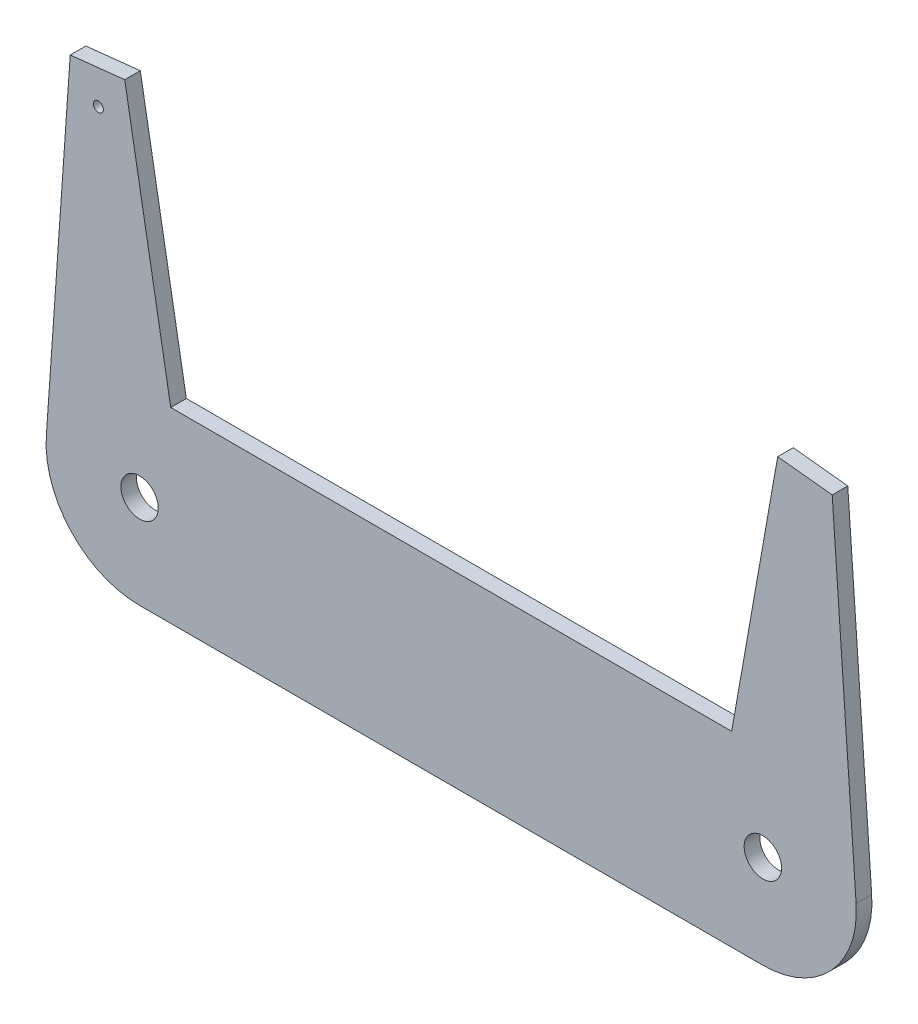
ISO-10303-21;
HEADER;
FILE_DESCRIPTION(('STEP AP214'),'2;1');
FILE_NAME('part.step','',(''),(''),'','','');
FILE_SCHEMA(('AUTOMOTIVE_DESIGN { 1 0 10303 214 1 1 1 1 }'));
ENDSEC;
DATA;
#1=APPLICATION_CONTEXT('core data for automotive mechanical design processes');
#2=APPLICATION_PROTOCOL_DEFINITION('international standard','automotive_design',2000,#1);
#3=PRODUCT_CONTEXT('',#1,'mechanical');
#4=PRODUCT('Part','Part','',(#3));
#5=PRODUCT_RELATED_PRODUCT_CATEGORY('part','',(#4));
#6=PRODUCT_DEFINITION_FORMATION('','',#4);
#7=PRODUCT_DEFINITION_CONTEXT('part definition',#1,'design');
#8=PRODUCT_DEFINITION('design','',#6,#7);
#9=PRODUCT_DEFINITION_SHAPE('','',#8);
#10=(LENGTH_UNIT() NAMED_UNIT(*) SI_UNIT(.MILLI.,.METRE.));
#11=(NAMED_UNIT(*) PLANE_ANGLE_UNIT() SI_UNIT($,.RADIAN.));
#12=(NAMED_UNIT(*) SI_UNIT($,.STERADIAN.) SOLID_ANGLE_UNIT());
#13=UNCERTAINTY_MEASURE_WITH_UNIT(LENGTH_MEASURE(1.E-05),#10,'distance_accuracy_value','');
#14=(GEOMETRIC_REPRESENTATION_CONTEXT(3) GLOBAL_UNCERTAINTY_ASSIGNED_CONTEXT((#13)) GLOBAL_UNIT_ASSIGNED_CONTEXT((#10,
#11,#12)) REPRESENTATION_CONTEXT('',''));
#15=CARTESIAN_POINT('',(0.,0.,0.));
#16=DIRECTION('',(0.,0.,1.));
#17=DIRECTION('',(1.,0.,0.));
#18=AXIS2_PLACEMENT_3D('',#15,#16,#17);
#19=CARTESIAN_POINT('',(-100.,0.,5.));
#20=DIRECTION('',(0.,0.,-1.));
#21=DIRECTION('',(-1.,0.,0.));
#22=AXIS2_PLACEMENT_3D('',#19,#20,#21);
#23=PLANE('',#22);
#24=DIRECTION('',(-0.069756473744122,-0.997564050259825,0.));
#25=VECTOR('',#24,1.);
#26=CARTESIAN_POINT('',(-122.253709395941,111.824739740904,5.));
#27=LINE('',#26,#25);
#28=CARTESIAN_POINT('',(-122.253709395941,111.824739740904,5.));
#29=VERTEX_POINT('',#28);
#30=CARTESIAN_POINT('',(-129.926921507795,2.0926942123237,5.));
#31=VERTEX_POINT('',#30);
#32=EDGE_CURVE('E161',#29,#31,#27,.T.);
#33=ORIENTED_EDGE('',*,*,#32,.T.);
#34=CARTESIAN_POINT('',(-100.,0.,5.));
#35=DIRECTION('',(0.,0.,1.));
#36=DIRECTION('',(-1.,0.,0.));
#37=AXIS2_PLACEMENT_3D('',#34,#35,#36);
#38=CIRCLE('',#37,30.);
#39=CARTESIAN_POINT('',(-100.,-30.,5.));
#40=VERTEX_POINT('',#39);
#41=EDGE_CURVE('E99',#31,#40,#38,.T.);
#42=ORIENTED_EDGE('',*,*,#41,.T.);
#43=DIRECTION('',(1.,0.,0.));
#44=VECTOR('',#43,1.);
#45=CARTESIAN_POINT('',(-100.,-30.,5.));
#46=LINE('',#45,#44);
#47=CARTESIAN_POINT('',(100.,-30.,5.));
#48=VERTEX_POINT('',#47);
#49=EDGE_CURVE('E182',#40,#48,#46,.T.);
#50=ORIENTED_EDGE('',*,*,#49,.T.);
#51=CARTESIAN_POINT('',(100.,0.,5.));
#52=DIRECTION('',(0.,0.,1.));
#53=DIRECTION('',(1.,0.,0.));
#54=AXIS2_PLACEMENT_3D('',#51,#52,#53);
#55=CIRCLE('',#54,30.);
#56=CARTESIAN_POINT('',(129.926921507795,2.0926942123236,5.));
#57=VERTEX_POINT('',#56);
#58=EDGE_CURVE('E201',#48,#57,#55,.T.);
#59=ORIENTED_EDGE('',*,*,#58,.T.);
#60=DIRECTION('',(-0.0697564737441215,0.997564050259824,0.));
#61=VECTOR('',#60,1.);
#62=CARTESIAN_POINT('',(122.253709395941,111.824739740904,5.));
#63=LINE('',#62,#61);
#64=CARTESIAN_POINT('',(122.253709395941,111.824739740904,5.));
#65=VERTEX_POINT('',#64);
#66=EDGE_CURVE('E198',#57,#65,#63,.T.);
#67=ORIENTED_EDGE('',*,*,#66,.T.);
#68=DIRECTION('',(-0.994251191251018,0.107072726200152,0.));
#69=VECTOR('',#68,1.);
#70=CARTESIAN_POINT('',(122.253709395941,111.824739740904,5.));
#71=LINE('',#70,#69);
#72=CARTESIAN_POINT('',(104.76009510169,113.708659006037,5.));
#73=VERTEX_POINT('',#72);
#74=EDGE_CURVE('E200',#65,#73,#71,.T.);
#75=ORIENTED_EDGE('',*,*,#74,.T.);
#76=DIRECTION('',(-0.173648177666936,-0.984807753012207,0.));
#77=VECTOR('',#76,1.);
#78=CARTESIAN_POINT('',(104.76009510169,113.708659006037,5.));
#79=LINE('',#78,#77);
#80=CARTESIAN_POINT('',(90.,30.0000000000001,5.));
#81=VERTEX_POINT('',#80);
#82=EDGE_CURVE('E124',#73,#81,#79,.T.);
#83=ORIENTED_EDGE('',*,*,#82,.T.);
#84=DIRECTION('',(-1.,0.,0.));
#85=VECTOR('',#84,1.);
#86=CARTESIAN_POINT('',(90.,30.0000000000001,5.));
#87=LINE('',#86,#85);
#88=CARTESIAN_POINT('',(-90.,30.0000000000001,5.));
#89=VERTEX_POINT('',#88);
#90=EDGE_CURVE('E118',#81,#89,#87,.T.);
#91=ORIENTED_EDGE('',*,*,#90,.T.);
#92=DIRECTION('',(-0.173648177666936,0.984807753012207,0.));
#93=VECTOR('',#92,1.);
#94=CARTESIAN_POINT('',(-104.76009510169,113.708659006038,5.));
#95=LINE('',#94,#93);
#96=CARTESIAN_POINT('',(-104.76009510169,113.708659006038,5.));
#97=VERTEX_POINT('',#96);
#98=EDGE_CURVE('E122',#89,#97,#95,.T.);
#99=ORIENTED_EDGE('',*,*,#98,.T.);
#100=DIRECTION('',(-0.994251191251018,-0.107072726200152,0.));
#101=VECTOR('',#100,1.);
#102=CARTESIAN_POINT('',(-122.253709395941,111.824739740904,5.));
#103=LINE('',#102,#101);
#104=EDGE_CURVE('E50',#97,#29,#103,.T.);
#105=ORIENTED_EDGE('',*,*,#104,.T.);
#106=EDGE_LOOP('',(#33,#42,#50,#59,#67,#75,#83,#91,#99,#105));
#107=FACE_BOUND('',#106,.T.);
#108=CARTESIAN_POINT('',(-113.211659226681,101.998451940931,5.));
#109=DIRECTION('',(0.,0.,1.));
#110=DIRECTION('',(1.,0.,0.));
#111=AXIS2_PLACEMENT_3D('',#108,#109,#110);
#112=CIRCLE('',#111,1.60000000000001);
#113=CARTESIAN_POINT('',(-111.611659226681,101.998451940931,5.));
#114=VERTEX_POINT('',#113);
#115=EDGE_CURVE('E146',#114,#114,#112,.T.);
#116=ORIENTED_EDGE('',*,*,#115,.F.);
#117=EDGE_LOOP('',(#116));
#118=FACE_BOUND('',#117,.T.);
#119=CARTESIAN_POINT('',(-100.,0.,5.));
#120=DIRECTION('',(0.,0.,1.));
#121=DIRECTION('',(1.,0.,0.));
#122=AXIS2_PLACEMENT_3D('',#119,#120,#121);
#123=CIRCLE('',#122,6.);
#124=CARTESIAN_POINT('',(-94.,0.,5.));
#125=VERTEX_POINT('',#124);
#126=EDGE_CURVE('E212',#125,#125,#123,.T.);
#127=ORIENTED_EDGE('',*,*,#126,.F.);
#128=EDGE_LOOP('',(#127));
#129=FACE_BOUND('',#128,.T.);
#130=CARTESIAN_POINT('',(100.,0.,5.));
#131=DIRECTION('',(0.,0.,1.));
#132=DIRECTION('',(1.,0.,0.));
#133=AXIS2_PLACEMENT_3D('',#130,#131,#132);
#134=CIRCLE('',#133,6.);
#135=CARTESIAN_POINT('',(106.,0.,5.));
#136=VERTEX_POINT('',#135);
#137=EDGE_CURVE('E218',#136,#136,#134,.T.);
#138=ORIENTED_EDGE('',*,*,#137,.F.);
#139=EDGE_LOOP('',(#138));
#140=FACE_BOUND('',#139,.T.);
#141=ADVANCED_FACE('F33',(#107,#118,#129,#140),#23,.F.);
#142=CARTESIAN_POINT('',(-100.,0.,0.));
#143=DIRECTION('',(0.,0.,-1.));
#144=DIRECTION('',(-1.,0.,0.));
#145=AXIS2_PLACEMENT_3D('',#142,#143,#144);
#146=PLANE('',#145);
#147=CARTESIAN_POINT('',(-100.,0.,0.));
#148=DIRECTION('',(0.,0.,1.));
#149=DIRECTION('',(1.,0.,0.));
#150=AXIS2_PLACEMENT_3D('',#147,#148,#149);
#151=CIRCLE('',#150,6.);
#152=CARTESIAN_POINT('',(-94.,0.,0.));
#153=VERTEX_POINT('',#152);
#154=EDGE_CURVE('E215',#153,#153,#151,.T.);
#155=ORIENTED_EDGE('',*,*,#154,.T.);
#156=EDGE_LOOP('',(#155));
#157=FACE_BOUND('',#156,.T.);
#158=DIRECTION('',(-0.069756473744122,-0.997564050259825,0.));
#159=VECTOR('',#158,1.);
#160=CARTESIAN_POINT('',(-122.253709395941,111.824739740904,0.));
#161=LINE('',#160,#159);
#162=CARTESIAN_POINT('',(-122.253709395941,111.824739740904,0.));
#163=VERTEX_POINT('',#162);
#164=CARTESIAN_POINT('',(-129.926921507795,2.0926942123237,0.));
#165=VERTEX_POINT('',#164);
#166=EDGE_CURVE('E142',#163,#165,#161,.T.);
#167=ORIENTED_EDGE('',*,*,#166,.F.);
#168=DIRECTION('',(-0.994251191251018,-0.107072726200152,0.));
#169=VECTOR('',#168,1.);
#170=CARTESIAN_POINT('',(-122.253709395941,111.824739740904,0.));
#171=LINE('',#170,#169);
#172=CARTESIAN_POINT('',(-104.76009510169,113.708659006038,0.));
#173=VERTEX_POINT('',#172);
#174=EDGE_CURVE('E91',#173,#163,#171,.T.);
#175=ORIENTED_EDGE('',*,*,#174,.F.);
#176=DIRECTION('',(-0.173648177666936,0.984807753012207,0.));
#177=VECTOR('',#176,1.);
#178=CARTESIAN_POINT('',(-104.76009510169,113.708659006038,0.));
#179=LINE('',#178,#177);
#180=CARTESIAN_POINT('',(-90.,30.0000000000001,0.));
#181=VERTEX_POINT('',#180);
#182=EDGE_CURVE('E85',#181,#173,#179,.T.);
#183=ORIENTED_EDGE('',*,*,#182,.F.);
#184=DIRECTION('',(-1.,0.,0.));
#185=VECTOR('',#184,1.);
#186=CARTESIAN_POINT('',(90.,30.0000000000001,0.));
#187=LINE('',#186,#185);
#188=CARTESIAN_POINT('',(90.,30.0000000000001,0.));
#189=VERTEX_POINT('',#188);
#190=EDGE_CURVE('E132',#189,#181,#187,.T.);
#191=ORIENTED_EDGE('',*,*,#190,.F.);
#192=DIRECTION('',(-0.173648177666936,-0.984807753012207,0.));
#193=VECTOR('',#192,1.);
#194=CARTESIAN_POINT('',(104.76009510169,113.708659006037,0.));
#195=LINE('',#194,#193);
#196=CARTESIAN_POINT('',(104.76009510169,113.708659006037,0.));
#197=VERTEX_POINT('',#196);
#198=EDGE_CURVE('E156',#197,#189,#195,.T.);
#199=ORIENTED_EDGE('',*,*,#198,.F.);
#200=DIRECTION('',(-0.994251191251018,0.107072726200152,0.));
#201=VECTOR('',#200,1.);
#202=CARTESIAN_POINT('',(122.253709395941,111.824739740904,0.));
#203=LINE('',#202,#201);
#204=CARTESIAN_POINT('',(122.253709395941,111.824739740904,0.));
#205=VERTEX_POINT('',#204);
#206=EDGE_CURVE('E154',#205,#197,#203,.T.);
#207=ORIENTED_EDGE('',*,*,#206,.F.);
#208=DIRECTION('',(-0.0697564737441215,0.997564050259824,0.));
#209=VECTOR('',#208,1.);
#210=CARTESIAN_POINT('',(122.253709395941,111.824739740904,0.));
#211=LINE('',#210,#209);
#212=CARTESIAN_POINT('',(129.926921507795,2.0926942123236,0.));
#213=VERTEX_POINT('',#212);
#214=EDGE_CURVE('E152',#213,#205,#211,.T.);
#215=ORIENTED_EDGE('',*,*,#214,.F.);
#216=CARTESIAN_POINT('',(100.,0.,0.));
#217=DIRECTION('',(0.,0.,1.));
#218=DIRECTION('',(1.,0.,0.));
#219=AXIS2_PLACEMENT_3D('',#216,#217,#218);
#220=CIRCLE('',#219,30.);
#221=CARTESIAN_POINT('',(100.,-30.,0.));
#222=VERTEX_POINT('',#221);
#223=EDGE_CURVE('E150',#222,#213,#220,.T.);
#224=ORIENTED_EDGE('',*,*,#223,.F.);
#225=DIRECTION('',(1.,0.,0.));
#226=VECTOR('',#225,1.);
#227=CARTESIAN_POINT('',(-100.,-30.,0.));
#228=LINE('',#227,#226);
#229=CARTESIAN_POINT('',(-100.,-30.,0.));
#230=VERTEX_POINT('',#229);
#231=EDGE_CURVE('E148',#230,#222,#228,.T.);
#232=ORIENTED_EDGE('',*,*,#231,.F.);
#233=CARTESIAN_POINT('',(-100.,0.,0.));
#234=DIRECTION('',(0.,0.,1.));
#235=DIRECTION('',(-1.,0.,0.));
#236=AXIS2_PLACEMENT_3D('',#233,#234,#235);
#237=CIRCLE('',#236,30.);
#238=EDGE_CURVE('E145',#165,#230,#237,.T.);
#239=ORIENTED_EDGE('',*,*,#238,.F.);
#240=EDGE_LOOP('',(#167,#175,#183,#191,#199,#207,#215,#224,#232,#239));
#241=FACE_BOUND('',#240,.T.);
#242=CARTESIAN_POINT('',(-113.211659226681,101.998451940931,0.));
#243=DIRECTION('',(0.,0.,1.));
#244=DIRECTION('',(1.,0.,0.));
#245=AXIS2_PLACEMENT_3D('',#242,#243,#244);
#246=CIRCLE('',#245,1.60000000000001);
#247=CARTESIAN_POINT('',(-111.611659226681,101.998451940931,0.));
#248=VERTEX_POINT('',#247);
#249=EDGE_CURVE('E209',#248,#248,#246,.T.);
#250=ORIENTED_EDGE('',*,*,#249,.T.);
#251=EDGE_LOOP('',(#250));
#252=FACE_BOUND('',#251,.T.);
#253=CARTESIAN_POINT('',(100.,0.,0.));
#254=DIRECTION('',(0.,0.,1.));
#255=DIRECTION('',(1.,0.,0.));
#256=AXIS2_PLACEMENT_3D('',#253,#254,#255);
#257=CIRCLE('',#256,6.);
#258=CARTESIAN_POINT('',(106.,0.,0.));
#259=VERTEX_POINT('',#258);
#260=EDGE_CURVE('E221',#259,#259,#257,.T.);
#261=ORIENTED_EDGE('',*,*,#260,.T.);
#262=EDGE_LOOP('',(#261));
#263=FACE_BOUND('',#262,.T.);
#264=ADVANCED_FACE('F186',(#157,#241,#252,#263),#146,.T.);
#265=CARTESIAN_POINT('',(-122.253709395941,111.824739740904,5.));
#266=DIRECTION('',(0.997564050259825,-0.069756473744122,0.));
#267=DIRECTION('',(0.069756473744122,0.997564050259825,0.));
#268=AXIS2_PLACEMENT_3D('',#265,#266,#267);
#269=PLANE('',#268);
#270=ORIENTED_EDGE('',*,*,#166,.T.);
#271=DIRECTION('',(0.,0.,-1.));
#272=VECTOR('',#271,1.);
#273=CARTESIAN_POINT('',(-129.926921507795,2.0926942123237,5.));
#274=LINE('',#273,#272);
#275=EDGE_CURVE('E11',#31,#165,#274,.T.);
#276=ORIENTED_EDGE('',*,*,#275,.F.);
#277=ORIENTED_EDGE('',*,*,#32,.F.);
#278=DIRECTION('',(0.,0.,-1.));
#279=VECTOR('',#278,1.);
#280=CARTESIAN_POINT('',(-122.253709395941,111.824739740904,5.));
#281=LINE('',#280,#279);
#282=EDGE_CURVE('E138',#29,#163,#281,.T.);
#283=ORIENTED_EDGE('',*,*,#282,.T.);
#284=EDGE_LOOP('',(#270,#276,#277,#283));
#285=FACE_BOUND('',#284,.T.);
#286=ADVANCED_FACE('F35',(#285),#269,.F.);
#287=CARTESIAN_POINT('',(-100.,0.,5.));
#288=DIRECTION('',(0.,0.,-1.));
#289=DIRECTION('',(-1.,0.,0.));
#290=AXIS2_PLACEMENT_3D('',#287,#288,#289);
#291=CYLINDRICAL_SURFACE('',#290,30.);
#292=ORIENTED_EDGE('',*,*,#238,.T.);
#293=DIRECTION('',(0.,0.,-1.));
#294=VECTOR('',#293,1.);
#295=CARTESIAN_POINT('',(-100.,-30.,5.));
#296=LINE('',#295,#294);
#297=EDGE_CURVE('E42',#40,#230,#296,.T.);
#298=ORIENTED_EDGE('',*,*,#297,.F.);
#299=ORIENTED_EDGE('',*,*,#41,.F.);
#300=ORIENTED_EDGE('',*,*,#275,.T.);
#301=EDGE_LOOP('',(#292,#298,#299,#300));
#302=FACE_BOUND('',#301,.T.);
#303=ADVANCED_FACE('F261',(#302),#291,.T.);
#304=CARTESIAN_POINT('',(-100.,-30.,5.));
#305=DIRECTION('',(0.,1.,0.));
#306=DIRECTION('',(-1.,0.,0.));
#307=AXIS2_PLACEMENT_3D('',#304,#305,#306);
#308=PLANE('',#307);
#309=ORIENTED_EDGE('',*,*,#231,.T.);
#310=DIRECTION('',(0.,0.,-1.));
#311=VECTOR('',#310,1.);
#312=CARTESIAN_POINT('',(100.,-30.,5.));
#313=LINE('',#312,#311);
#314=EDGE_CURVE('E174',#48,#222,#313,.T.);
#315=ORIENTED_EDGE('',*,*,#314,.F.);
#316=ORIENTED_EDGE('',*,*,#49,.F.);
#317=ORIENTED_EDGE('',*,*,#297,.T.);
#318=EDGE_LOOP('',(#309,#315,#316,#317));
#319=FACE_BOUND('',#318,.T.);
#320=ADVANCED_FACE('F180',(#319),#308,.F.);
#321=CARTESIAN_POINT('',(100.,0.,5.));
#322=DIRECTION('',(0.,0.,-1.));
#323=DIRECTION('',(-1.,0.,0.));
#324=AXIS2_PLACEMENT_3D('',#321,#322,#323);
#325=CYLINDRICAL_SURFACE('',#324,30.);
#326=ORIENTED_EDGE('',*,*,#223,.T.);
#327=DIRECTION('',(0.,0.,-1.));
#328=VECTOR('',#327,1.);
#329=CARTESIAN_POINT('',(129.926921507795,2.0926942123236,5.));
#330=LINE('',#329,#328);
#331=EDGE_CURVE('E171',#57,#213,#330,.T.);
#332=ORIENTED_EDGE('',*,*,#331,.F.);
#333=ORIENTED_EDGE('',*,*,#58,.F.);
#334=ORIENTED_EDGE('',*,*,#314,.T.);
#335=EDGE_LOOP('',(#326,#332,#333,#334));
#336=FACE_BOUND('',#335,.T.);
#337=ADVANCED_FACE('F192',(#336),#325,.T.);
#338=CARTESIAN_POINT('',(122.253709395941,111.824739740904,5.));
#339=DIRECTION('',(-0.997564050259825,-0.0697564737441215,0.));
#340=DIRECTION('',(0.0697564737441215,-0.997564050259825,0.));
#341=AXIS2_PLACEMENT_3D('',#338,#339,#340);
#342=PLANE('',#341);
#343=ORIENTED_EDGE('',*,*,#214,.T.);
#344=DIRECTION('',(0.,0.,-1.));
#345=VECTOR('',#344,1.);
#346=CARTESIAN_POINT('',(122.253709395941,111.824739740904,5.));
#347=LINE('',#346,#345);
#348=EDGE_CURVE('E168',#65,#205,#347,.T.);
#349=ORIENTED_EDGE('',*,*,#348,.F.);
#350=ORIENTED_EDGE('',*,*,#66,.F.);
#351=ORIENTED_EDGE('',*,*,#331,.T.);
#352=EDGE_LOOP('',(#343,#349,#350,#351));
#353=FACE_BOUND('',#352,.T.);
#354=ADVANCED_FACE('F196',(#353),#342,.F.);
#355=CARTESIAN_POINT('',(122.253709395941,111.824739740904,5.));
#356=DIRECTION('',(-0.107072726200152,-0.994251191251017,0.));
#357=DIRECTION('',(0.994251191251017,-0.107072726200152,0.));
#358=AXIS2_PLACEMENT_3D('',#355,#356,#357);
#359=PLANE('',#358);
#360=ORIENTED_EDGE('',*,*,#206,.T.);
#361=DIRECTION('',(0.,0.,-1.));
#362=VECTOR('',#361,1.);
#363=CARTESIAN_POINT('',(104.76009510169,113.708659006037,5.));
#364=LINE('',#363,#362);
#365=EDGE_CURVE('E165',#73,#197,#364,.T.);
#366=ORIENTED_EDGE('',*,*,#365,.F.);
#367=ORIENTED_EDGE('',*,*,#74,.F.);
#368=ORIENTED_EDGE('',*,*,#348,.T.);
#369=EDGE_LOOP('',(#360,#366,#367,#368));
#370=FACE_BOUND('',#369,.T.);
#371=ADVANCED_FACE('F251',(#370),#359,.F.);
#372=CARTESIAN_POINT('',(104.76009510169,113.708659006037,5.));
#373=DIRECTION('',(0.984807753012207,-0.173648177666936,0.));
#374=DIRECTION('',(0.173648177666936,0.984807753012207,0.));
#375=AXIS2_PLACEMENT_3D('',#372,#373,#374);
#376=PLANE('',#375);
#377=ORIENTED_EDGE('',*,*,#198,.T.);
#378=DIRECTION('',(0.,0.,-1.));
#379=VECTOR('',#378,1.);
#380=CARTESIAN_POINT('',(90.,30.0000000000001,5.));
#381=LINE('',#380,#379);
#382=EDGE_CURVE('E133',#81,#189,#381,.T.);
#383=ORIENTED_EDGE('',*,*,#382,.F.);
#384=ORIENTED_EDGE('',*,*,#82,.F.);
#385=ORIENTED_EDGE('',*,*,#365,.T.);
#386=EDGE_LOOP('',(#377,#383,#384,#385));
#387=FACE_BOUND('',#386,.T.);
#388=ADVANCED_FACE('F248',(#387),#376,.F.);
#389=CARTESIAN_POINT('',(90.,30.0000000000001,5.));
#390=DIRECTION('',(0.,-1.,0.));
#391=DIRECTION('',(0.,0.,-1.));
#392=AXIS2_PLACEMENT_3D('',#389,#390,#391);
#393=PLANE('',#392);
#394=ORIENTED_EDGE('',*,*,#190,.T.);
#395=DIRECTION('',(0.,0.,-1.));
#396=VECTOR('',#395,1.);
#397=CARTESIAN_POINT('',(-90.,30.0000000000001,5.));
#398=LINE('',#397,#396);
#399=EDGE_CURVE('E129',#89,#181,#398,.T.);
#400=ORIENTED_EDGE('',*,*,#399,.F.);
#401=ORIENTED_EDGE('',*,*,#90,.F.);
#402=ORIENTED_EDGE('',*,*,#382,.T.);
#403=EDGE_LOOP('',(#394,#400,#401,#402));
#404=FACE_BOUND('',#403,.T.);
#405=ADVANCED_FACE('F130',(#404),#393,.F.);
#406=CARTESIAN_POINT('',(-104.76009510169,113.708659006038,5.));
#407=DIRECTION('',(-0.984807753012207,-0.173648177666936,0.));
#408=DIRECTION('',(0.173648177666936,-0.984807753012207,0.));
#409=AXIS2_PLACEMENT_3D('',#406,#407,#408);
#410=PLANE('',#409);
#411=ORIENTED_EDGE('',*,*,#182,.T.);
#412=DIRECTION('',(0.,0.,-1.));
#413=VECTOR('',#412,1.);
#414=CARTESIAN_POINT('',(-104.76009510169,113.708659006038,5.));
#415=LINE('',#414,#413);
#416=EDGE_CURVE('E134',#97,#173,#415,.T.);
#417=ORIENTED_EDGE('',*,*,#416,.F.);
#418=ORIENTED_EDGE('',*,*,#98,.F.);
#419=ORIENTED_EDGE('',*,*,#399,.T.);
#420=EDGE_LOOP('',(#411,#417,#418,#419));
#421=FACE_BOUND('',#420,.T.);
#422=ADVANCED_FACE('F136',(#421),#410,.F.);
#423=CARTESIAN_POINT('',(-122.253709395941,111.824739740904,5.));
#424=DIRECTION('',(0.107072726200152,-0.994251191251017,0.));
#425=DIRECTION('',(0.994251191251017,0.107072726200152,0.));
#426=AXIS2_PLACEMENT_3D('',#423,#424,#425);
#427=PLANE('',#426);
#428=ORIENTED_EDGE('',*,*,#174,.T.);
#429=ORIENTED_EDGE('',*,*,#282,.F.);
#430=ORIENTED_EDGE('',*,*,#104,.F.);
#431=ORIENTED_EDGE('',*,*,#416,.T.);
#432=EDGE_LOOP('',(#428,#429,#430,#431));
#433=FACE_BOUND('',#432,.T.);
#434=ADVANCED_FACE('F241',(#433),#427,.F.);
#435=CARTESIAN_POINT('',(-113.211659226681,101.998451940931,5.));
#436=DIRECTION('',(0.,0.,-1.));
#437=DIRECTION('',(-1.,0.,0.));
#438=AXIS2_PLACEMENT_3D('',#435,#436,#437);
#439=CYLINDRICAL_SURFACE('',#438,1.60000000000001);
#440=ORIENTED_EDGE('',*,*,#115,.T.);
#441=EDGE_LOOP('',(#440));
#442=FACE_BOUND('',#441,.T.);
#443=ORIENTED_EDGE('',*,*,#249,.F.);
#444=EDGE_LOOP('',(#443));
#445=FACE_BOUND('',#444,.T.);
#446=ADVANCED_FACE('F238',(#442,#445),#439,.F.);
#447=CARTESIAN_POINT('',(-100.,0.,5.));
#448=DIRECTION('',(0.,0.,-1.));
#449=DIRECTION('',(-1.,0.,0.));
#450=AXIS2_PLACEMENT_3D('',#447,#448,#449);
#451=CYLINDRICAL_SURFACE('',#450,6.);
#452=ORIENTED_EDGE('',*,*,#126,.T.);
#453=EDGE_LOOP('',(#452));
#454=FACE_BOUND('',#453,.T.);
#455=ORIENTED_EDGE('',*,*,#154,.F.);
#456=EDGE_LOOP('',(#455));
#457=FACE_BOUND('',#456,.T.);
#458=ADVANCED_FACE('F337',(#454,#457),#451,.F.);
#459=CARTESIAN_POINT('',(100.,0.,5.));
#460=DIRECTION('',(0.,0.,-1.));
#461=DIRECTION('',(-1.,0.,0.));
#462=AXIS2_PLACEMENT_3D('',#459,#460,#461);
#463=CYLINDRICAL_SURFACE('',#462,6.);
#464=ORIENTED_EDGE('',*,*,#137,.T.);
#465=EDGE_LOOP('',(#464));
#466=FACE_BOUND('',#465,.T.);
#467=ORIENTED_EDGE('',*,*,#260,.F.);
#468=EDGE_LOOP('',(#467));
#469=FACE_BOUND('',#468,.T.);
#470=ADVANCED_FACE('F227',(#466,#469),#463,.F.);
#471=CLOSED_SHELL('',(#141,#264,#286,#303,#320,#337,#354,#371,#388,#405,#422,#434,#446,#458,#470));
#472=MANIFOLD_SOLID_BREP('B2',#471);
#473=ADVANCED_BREP_SHAPE_REPRESENTATION('',(#18,#472),#14);
#474=SHAPE_DEFINITION_REPRESENTATION(#9,#473);
ENDSEC;
END-ISO-10303-21;
